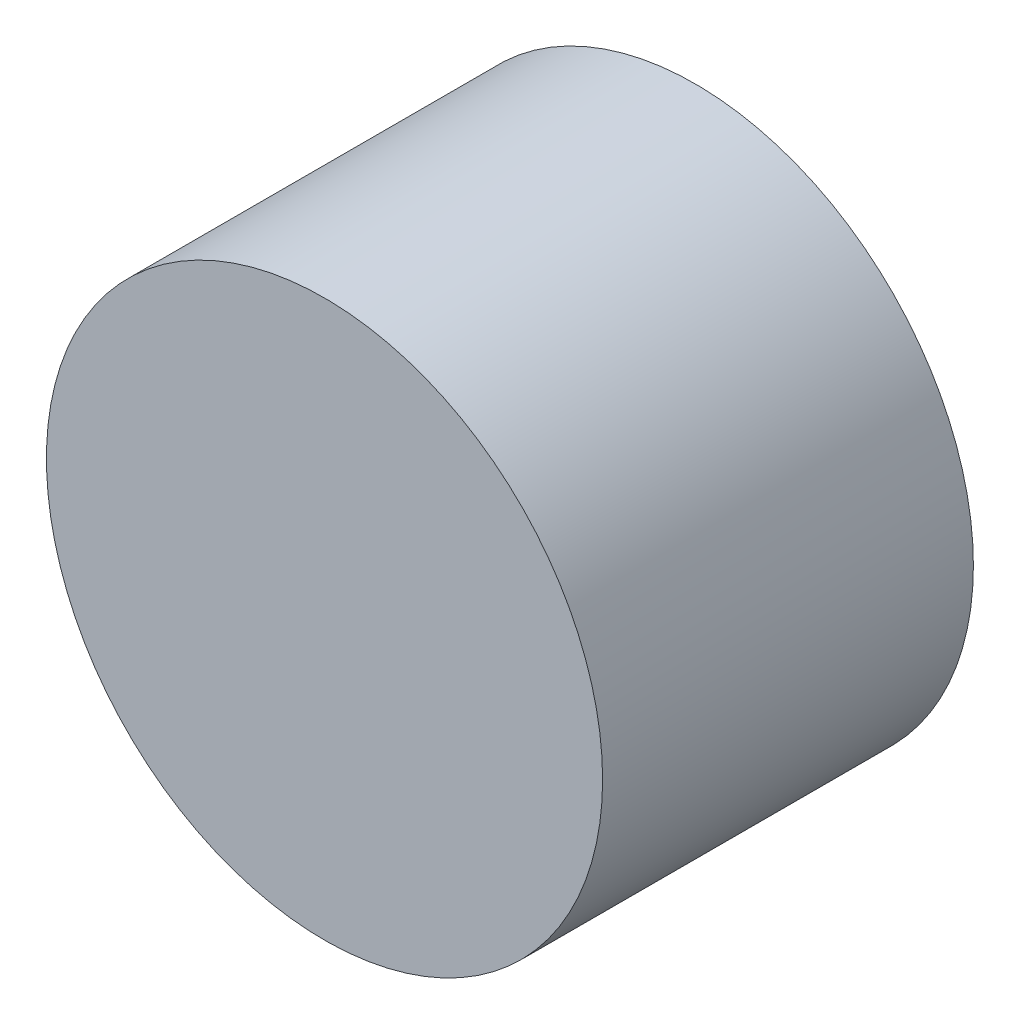
ISO-10303-21;
HEADER;
FILE_DESCRIPTION(('STEP AP214'),'2;1');
FILE_NAME('part.step','',(''),(''),'','','');
FILE_SCHEMA(('AUTOMOTIVE_DESIGN { 1 0 10303 214 1 1 1 1 }'));
ENDSEC;
DATA;
#1=APPLICATION_CONTEXT('core data for automotive mechanical design processes');
#2=APPLICATION_PROTOCOL_DEFINITION('international standard','automotive_design',2000,#1);
#3=PRODUCT_CONTEXT('',#1,'mechanical');
#4=PRODUCT('Part','Part','',(#3));
#5=PRODUCT_RELATED_PRODUCT_CATEGORY('part','',(#4));
#6=PRODUCT_DEFINITION_FORMATION('','',#4);
#7=PRODUCT_DEFINITION_CONTEXT('part definition',#1,'design');
#8=PRODUCT_DEFINITION('design','',#6,#7);
#9=PRODUCT_DEFINITION_SHAPE('','',#8);
#10=(LENGTH_UNIT() NAMED_UNIT(*) SI_UNIT(.MILLI.,.METRE.));
#11=(NAMED_UNIT(*) PLANE_ANGLE_UNIT() SI_UNIT($,.RADIAN.));
#12=(NAMED_UNIT(*) SI_UNIT($,.STERADIAN.) SOLID_ANGLE_UNIT());
#13=UNCERTAINTY_MEASURE_WITH_UNIT(LENGTH_MEASURE(1.E-05),#10,'distance_accuracy_value','');
#14=(GEOMETRIC_REPRESENTATION_CONTEXT(3) GLOBAL_UNCERTAINTY_ASSIGNED_CONTEXT((#13)) GLOBAL_UNIT_ASSIGNED_CONTEXT((#10,
#11,#12)) REPRESENTATION_CONTEXT('',''));
#15=CARTESIAN_POINT('',(0.,0.,0.));
#16=DIRECTION('',(0.,0.,1.));
#17=DIRECTION('',(1.,0.,0.));
#18=AXIS2_PLACEMENT_3D('',#15,#16,#17);
#19=CARTESIAN_POINT('',(0.,0.,4.));
#20=DIRECTION('',(0.,0.,-1.));
#21=DIRECTION('',(-1.,0.,0.));
#22=AXIS2_PLACEMENT_3D('',#19,#20,#21);
#23=CYLINDRICAL_SURFACE('',#22,3.);
#24=CARTESIAN_POINT('',(0.,0.,4.));
#25=DIRECTION('',(0.,0.,1.));
#26=DIRECTION('',(1.,0.,0.));
#27=AXIS2_PLACEMENT_3D('',#24,#25,#26);
#28=CIRCLE('',#27,3.);
#29=CARTESIAN_POINT('',(3.,0.,4.));
#30=VERTEX_POINT('',#29);
#31=EDGE_CURVE('E10',#30,#30,#28,.T.);
#32=ORIENTED_EDGE('',*,*,#31,.F.);
#33=EDGE_LOOP('',(#32));
#34=FACE_BOUND('',#33,.T.);
#35=CARTESIAN_POINT('',(0.,0.,0.));
#36=DIRECTION('',(0.,0.,1.));
#37=DIRECTION('',(1.,0.,0.));
#38=AXIS2_PLACEMENT_3D('',#35,#36,#37);
#39=CIRCLE('',#38,3.);
#40=CARTESIAN_POINT('',(3.,0.,0.));
#41=VERTEX_POINT('',#40);
#42=EDGE_CURVE('E34',#41,#41,#39,.T.);
#43=ORIENTED_EDGE('',*,*,#42,.T.);
#44=EDGE_LOOP('',(#43));
#45=FACE_BOUND('',#44,.T.);
#46=ADVANCED_FACE('F31',(#34,#45),#23,.T.);
#47=CARTESIAN_POINT('',(0.,0.,4.));
#48=DIRECTION('',(0.,0.,1.));
#49=DIRECTION('',(1.,0.,0.));
#50=AXIS2_PLACEMENT_3D('',#47,#48,#49);
#51=PLANE('',#50);
#52=ORIENTED_EDGE('',*,*,#31,.T.);
#53=EDGE_LOOP('',(#52));
#54=FACE_BOUND('',#53,.T.);
#55=ADVANCED_FACE('F46',(#54),#51,.T.);
#56=CARTESIAN_POINT('',(0.,0.,0.));
#57=DIRECTION('',(0.,0.,1.));
#58=DIRECTION('',(1.,0.,0.));
#59=AXIS2_PLACEMENT_3D('',#56,#57,#58);
#60=PLANE('',#59);
#61=ORIENTED_EDGE('',*,*,#42,.F.);
#62=EDGE_LOOP('',(#61));
#63=FACE_BOUND('',#62,.T.);
#64=ADVANCED_FACE('F44',(#63),#60,.F.);
#65=CLOSED_SHELL('',(#46,#55,#64));
#66=MANIFOLD_SOLID_BREP('B2',#65);
#67=ADVANCED_BREP_SHAPE_REPRESENTATION('',(#18,#66),#14);
#68=SHAPE_DEFINITION_REPRESENTATION(#9,#67);
ENDSEC;
END-ISO-10303-21;
